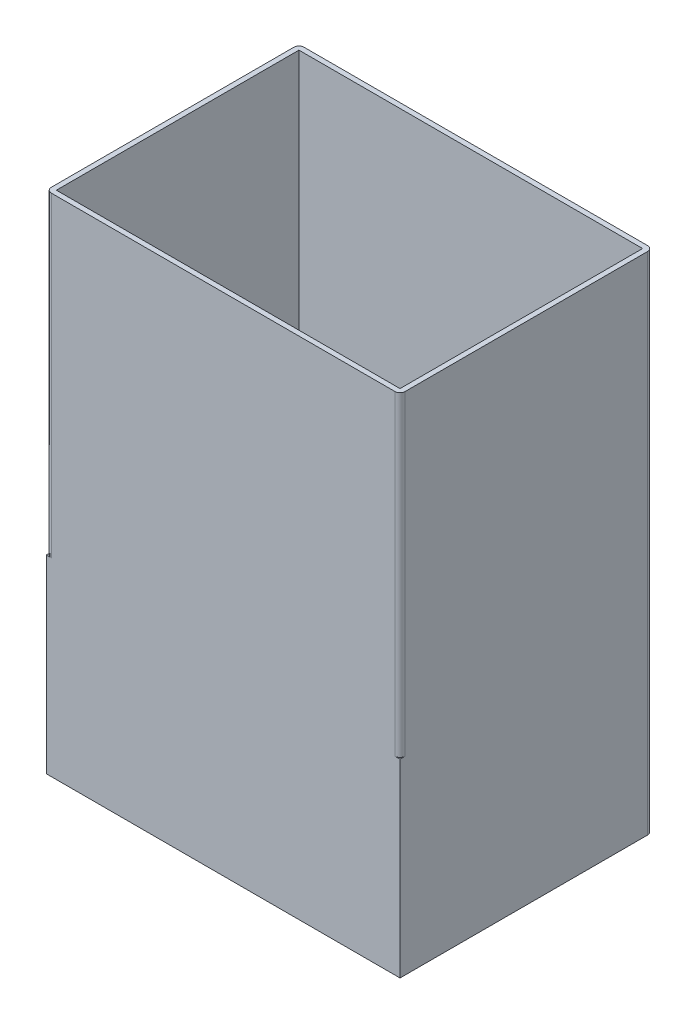
ISO-10303-21;
HEADER;
FILE_DESCRIPTION(('STEP AP214'),'2;1');
FILE_NAME('part.step','',(''),(''),'','','');
FILE_SCHEMA(('AUTOMOTIVE_DESIGN { 1 0 10303 214 1 1 1 1 }'));
ENDSEC;
DATA;
#1=APPLICATION_CONTEXT('core data for automotive mechanical design processes');
#2=APPLICATION_PROTOCOL_DEFINITION('international standard','automotive_design',2000,#1);
#3=PRODUCT_CONTEXT('',#1,'mechanical');
#4=PRODUCT('Part','Part','',(#3));
#5=PRODUCT_RELATED_PRODUCT_CATEGORY('part','',(#4));
#6=PRODUCT_DEFINITION_FORMATION('','',#4);
#7=PRODUCT_DEFINITION_CONTEXT('part definition',#1,'design');
#8=PRODUCT_DEFINITION('design','',#6,#7);
#9=PRODUCT_DEFINITION_SHAPE('','',#8);
#10=(LENGTH_UNIT() NAMED_UNIT(*) SI_UNIT(.MILLI.,.METRE.));
#11=(NAMED_UNIT(*) PLANE_ANGLE_UNIT() SI_UNIT($,.RADIAN.));
#12=(NAMED_UNIT(*) SI_UNIT($,.STERADIAN.) SOLID_ANGLE_UNIT());
#13=UNCERTAINTY_MEASURE_WITH_UNIT(LENGTH_MEASURE(1.E-05),#10,'distance_accuracy_value','');
#14=(GEOMETRIC_REPRESENTATION_CONTEXT(3) GLOBAL_UNCERTAINTY_ASSIGNED_CONTEXT((#13)) GLOBAL_UNIT_ASSIGNED_CONTEXT((#10,
#11,#12)) REPRESENTATION_CONTEXT('',''));
#15=CARTESIAN_POINT('',(0.,0.,0.));
#16=DIRECTION('',(0.,0.,1.));
#17=DIRECTION('',(1.,0.,0.));
#18=AXIS2_PLACEMENT_3D('',#15,#16,#17);
#19=CARTESIAN_POINT('',(0.,254.,0.));
#20=DIRECTION('',(1.,0.,0.));
#21=DIRECTION('',(0.,0.,-1.));
#22=AXIS2_PLACEMENT_3D('',#19,#20,#21);
#23=PLANE('',#22);
#24=DIRECTION('',(0.,-1.,0.));
#25=VECTOR('',#24,1.);
#26=CARTESIAN_POINT('',(0.,254.,0.));
#27=LINE('',#26,#25);
#28=CARTESIAN_POINT('',(0.,95.25,0.));
#29=VERTEX_POINT('',#28);
#30=CARTESIAN_POINT('',(0.,0.,0.));
#31=VERTEX_POINT('',#30);
#32=EDGE_CURVE('E213',#29,#31,#27,.T.);
#33=ORIENTED_EDGE('',*,*,#32,.F.);
#34=DIRECTION('',(0.,0.,-1.));
#35=VECTOR('',#34,1.);
#36=CARTESIAN_POINT('',(0.,95.25,-2.54));
#37=LINE('',#36,#35);
#38=CARTESIAN_POINT('',(0.,95.25,-2.54));
#39=VERTEX_POINT('',#38);
#40=EDGE_CURVE('E250',#29,#39,#37,.T.);
#41=ORIENTED_EDGE('',*,*,#40,.T.);
#42=DIRECTION('',(0.,-1.,0.));
#43=VECTOR('',#42,1.);
#44=CARTESIAN_POINT('',(0.,254.,-2.54));
#45=LINE('',#44,#43);
#46=CARTESIAN_POINT('',(0.,254.,-2.54));
#47=VERTEX_POINT('',#46);
#48=EDGE_CURVE('E244',#39,#47,#45,.F.);
#49=ORIENTED_EDGE('',*,*,#48,.T.);
#50=DIRECTION('',(0.,0.,1.));
#51=VECTOR('',#50,1.);
#52=CARTESIAN_POINT('',(0.,254.,0.));
#53=LINE('',#52,#51);
#54=CARTESIAN_POINT('',(0.,254.,-124.46));
#55=VERTEX_POINT('',#54);
#56=EDGE_CURVE('E195',#55,#47,#53,.T.);
#57=ORIENTED_EDGE('',*,*,#56,.F.);
#58=DIRECTION('',(0.,-1.,0.));
#59=VECTOR('',#58,1.);
#60=CARTESIAN_POINT('',(0.,254.,-124.46));
#61=LINE('',#60,#59);
#62=CARTESIAN_POINT('',(0.,0.,-124.46));
#63=VERTEX_POINT('',#62);
#64=EDGE_CURVE('E231',#55,#63,#61,.T.);
#65=ORIENTED_EDGE('',*,*,#64,.T.);
#66=DIRECTION('',(0.,0.,1.));
#67=VECTOR('',#66,1.);
#68=CARTESIAN_POINT('',(0.,0.,0.));
#69=LINE('',#68,#67);
#70=EDGE_CURVE('E189',#63,#31,#69,.T.);
#71=ORIENTED_EDGE('',*,*,#70,.T.);
#72=EDGE_LOOP('',(#33,#41,#49,#57,#65,#71));
#73=FACE_BOUND('',#72,.T.);
#74=ADVANCED_FACE('F43',(#73),#23,.F.);
#75=CARTESIAN_POINT('',(0.,254.,0.));
#76=DIRECTION('',(0.,0.,-1.));
#77=DIRECTION('',(-1.,0.,0.));
#78=AXIS2_PLACEMENT_3D('',#75,#76,#77);
#79=PLANE('',#78);
#80=DIRECTION('',(1.,0.,0.));
#81=VECTOR('',#80,1.);
#82=CARTESIAN_POINT('',(0.,254.,0.));
#83=LINE('',#82,#81);
#84=CARTESIAN_POINT('',(2.54,254.,0.));
#85=VERTEX_POINT('',#84);
#86=CARTESIAN_POINT('',(175.26,254.,0.));
#87=VERTEX_POINT('',#86);
#88=EDGE_CURVE('E193',#85,#87,#83,.T.);
#89=ORIENTED_EDGE('',*,*,#88,.F.);
#90=DIRECTION('',(0.,-1.,0.));
#91=VECTOR('',#90,1.);
#92=CARTESIAN_POINT('',(2.54,254.,0.));
#93=LINE('',#92,#91);
#94=CARTESIAN_POINT('',(2.54,95.25,0.));
#95=VERTEX_POINT('',#94);
#96=EDGE_CURVE('E245',#85,#95,#93,.T.);
#97=ORIENTED_EDGE('',*,*,#96,.T.);
#98=DIRECTION('',(-1.,0.,0.));
#99=VECTOR('',#98,1.);
#100=CARTESIAN_POINT('',(2.54,95.25,0.));
#101=LINE('',#100,#99);
#102=EDGE_CURVE('E239',#95,#29,#101,.T.);
#103=ORIENTED_EDGE('',*,*,#102,.T.);
#104=ORIENTED_EDGE('',*,*,#32,.T.);
#105=DIRECTION('',(1.,0.,0.));
#106=VECTOR('',#105,1.);
#107=CARTESIAN_POINT('',(0.,0.,0.));
#108=LINE('',#107,#106);
#109=CARTESIAN_POINT('',(177.8,0.,0.));
#110=VERTEX_POINT('',#109);
#111=EDGE_CURVE('E207',#31,#110,#108,.T.);
#112=ORIENTED_EDGE('',*,*,#111,.T.);
#113=DIRECTION('',(0.,-1.,0.));
#114=VECTOR('',#113,1.);
#115=CARTESIAN_POINT('',(177.8,254.,0.));
#116=LINE('',#115,#114);
#117=CARTESIAN_POINT('',(177.8,95.25,0.));
#118=VERTEX_POINT('',#117);
#119=EDGE_CURVE('E205',#118,#110,#116,.T.);
#120=ORIENTED_EDGE('',*,*,#119,.F.);
#121=DIRECTION('',(-1.,0.,0.));
#122=VECTOR('',#121,1.);
#123=CARTESIAN_POINT('',(175.26,95.25,0.));
#124=LINE('',#123,#122);
#125=CARTESIAN_POINT('',(175.26,95.25,0.));
#126=VERTEX_POINT('',#125);
#127=EDGE_CURVE('E238',#118,#126,#124,.T.);
#128=ORIENTED_EDGE('',*,*,#127,.T.);
#129=DIRECTION('',(0.,-1.,0.));
#130=VECTOR('',#129,1.);
#131=CARTESIAN_POINT('',(175.26,254.,0.));
#132=LINE('',#131,#130);
#133=EDGE_CURVE('E236',#126,#87,#132,.F.);
#134=ORIENTED_EDGE('',*,*,#133,.T.);
#135=EDGE_LOOP('',(#89,#97,#103,#104,#112,#120,#128,#134));
#136=FACE_BOUND('',#135,.T.);
#137=ADVANCED_FACE('F264',(#136),#79,.F.);
#138=CARTESIAN_POINT('',(177.8,254.,0.));
#139=DIRECTION('',(-1.,0.,0.));
#140=DIRECTION('',(0.,0.,1.));
#141=AXIS2_PLACEMENT_3D('',#138,#139,#140);
#142=PLANE('',#141);
#143=DIRECTION('',(0.,0.,-1.));
#144=VECTOR('',#143,1.);
#145=CARTESIAN_POINT('',(177.8,254.,0.));
#146=LINE('',#145,#144);
#147=CARTESIAN_POINT('',(177.8,254.,-2.54));
#148=VERTEX_POINT('',#147);
#149=CARTESIAN_POINT('',(177.8,254.,-124.46));
#150=VERTEX_POINT('',#149);
#151=EDGE_CURVE('E196',#148,#150,#146,.T.);
#152=ORIENTED_EDGE('',*,*,#151,.F.);
#153=DIRECTION('',(0.,-1.,0.));
#154=VECTOR('',#153,1.);
#155=CARTESIAN_POINT('',(177.8,254.,-2.54));
#156=LINE('',#155,#154);
#157=CARTESIAN_POINT('',(177.8,95.25,-2.54));
#158=VERTEX_POINT('',#157);
#159=EDGE_CURVE('E11',#148,#158,#156,.T.);
#160=ORIENTED_EDGE('',*,*,#159,.T.);
#161=DIRECTION('',(0.,0.,1.));
#162=VECTOR('',#161,1.);
#163=CARTESIAN_POINT('',(177.8,95.25,-2.54));
#164=LINE('',#163,#162);
#165=EDGE_CURVE('E55',#158,#118,#164,.T.);
#166=ORIENTED_EDGE('',*,*,#165,.T.);
#167=ORIENTED_EDGE('',*,*,#119,.T.);
#168=DIRECTION('',(0.,0.,-1.));
#169=VECTOR('',#168,1.);
#170=CARTESIAN_POINT('',(177.8,0.,0.));
#171=LINE('',#170,#169);
#172=CARTESIAN_POINT('',(177.8,0.,-124.46));
#173=VERTEX_POINT('',#172);
#174=EDGE_CURVE('E209',#110,#173,#171,.T.);
#175=ORIENTED_EDGE('',*,*,#174,.T.);
#176=DIRECTION('',(0.,-1.,0.));
#177=VECTOR('',#176,1.);
#178=CARTESIAN_POINT('',(177.8,254.,-124.46));
#179=LINE('',#178,#177);
#180=EDGE_CURVE('E228',#173,#150,#179,.F.);
#181=ORIENTED_EDGE('',*,*,#180,.T.);
#182=EDGE_LOOP('',(#152,#160,#166,#167,#175,#181));
#183=FACE_BOUND('',#182,.T.);
#184=ADVANCED_FACE('F266',(#183),#142,.F.);
#185=CARTESIAN_POINT('',(0.,254.,-127.));
#186=DIRECTION('',(0.,0.,1.));
#187=DIRECTION('',(1.,0.,0.));
#188=AXIS2_PLACEMENT_3D('',#185,#186,#187);
#189=PLANE('',#188);
#190=DIRECTION('',(-1.,0.,0.));
#191=VECTOR('',#190,1.);
#192=CARTESIAN_POINT('',(0.,254.,-127.));
#193=LINE('',#192,#191);
#194=CARTESIAN_POINT('',(175.26,254.,-127.));
#195=VERTEX_POINT('',#194);
#196=CARTESIAN_POINT('',(2.54,254.,-127.));
#197=VERTEX_POINT('',#196);
#198=EDGE_CURVE('E199',#195,#197,#193,.T.);
#199=ORIENTED_EDGE('',*,*,#198,.F.);
#200=DIRECTION('',(0.,-1.,0.));
#201=VECTOR('',#200,1.);
#202=CARTESIAN_POINT('',(175.26,254.,-127.));
#203=LINE('',#202,#201);
#204=CARTESIAN_POINT('',(175.26,0.,-127.));
#205=VERTEX_POINT('',#204);
#206=EDGE_CURVE('E217',#195,#205,#203,.T.);
#207=ORIENTED_EDGE('',*,*,#206,.T.);
#208=DIRECTION('',(-1.,0.,0.));
#209=VECTOR('',#208,1.);
#210=CARTESIAN_POINT('',(0.,0.,-127.));
#211=LINE('',#210,#209);
#212=CARTESIAN_POINT('',(2.54,0.,-127.));
#213=VERTEX_POINT('',#212);
#214=EDGE_CURVE('E198',#205,#213,#211,.T.);
#215=ORIENTED_EDGE('',*,*,#214,.T.);
#216=DIRECTION('',(0.,-1.,0.));
#217=VECTOR('',#216,1.);
#218=CARTESIAN_POINT('',(2.54,254.,-127.));
#219=LINE('',#218,#217);
#220=EDGE_CURVE('E220',#213,#197,#219,.F.);
#221=ORIENTED_EDGE('',*,*,#220,.T.);
#222=EDGE_LOOP('',(#199,#207,#215,#221));
#223=FACE_BOUND('',#222,.T.);
#224=ADVANCED_FACE('F279',(#223),#189,.F.);
#225=CARTESIAN_POINT('',(0.,254.,0.));
#226=DIRECTION('',(0.,-1.,0.));
#227=DIRECTION('',(0.,0.,-1.));
#228=AXIS2_PLACEMENT_3D('',#225,#226,#227);
#229=PLANE('',#228);
#230=DIRECTION('',(1.,0.,0.));
#231=VECTOR('',#230,1.);
#232=CARTESIAN_POINT('',(2.54000000000002,254.,-2.53999999999998));
#233=LINE('',#232,#231);
#234=CARTESIAN_POINT('',(2.54000000000002,254.,-2.53999999999998));
#235=VERTEX_POINT('',#234);
#236=CARTESIAN_POINT('',(175.26,254.,-2.53999999999998));
#237=VERTEX_POINT('',#236);
#238=EDGE_CURVE('E181',#235,#237,#233,.T.);
#239=ORIENTED_EDGE('',*,*,#238,.F.);
#240=DIRECTION('',(0.,0.,1.));
#241=VECTOR('',#240,1.);
#242=CARTESIAN_POINT('',(2.54,254.,-124.46));
#243=LINE('',#242,#241);
#244=CARTESIAN_POINT('',(2.54,254.,-124.46));
#245=VERTEX_POINT('',#244);
#246=EDGE_CURVE('E154',#245,#235,#243,.T.);
#247=ORIENTED_EDGE('',*,*,#246,.F.);
#248=DIRECTION('',(-1.,0.,0.));
#249=VECTOR('',#248,1.);
#250=CARTESIAN_POINT('',(2.54,254.,-124.46));
#251=LINE('',#250,#249);
#252=CARTESIAN_POINT('',(175.26,254.,-124.46));
#253=VERTEX_POINT('',#252);
#254=EDGE_CURVE('E175',#253,#245,#251,.T.);
#255=ORIENTED_EDGE('',*,*,#254,.F.);
#256=DIRECTION('',(0.,0.,-1.));
#257=VECTOR('',#256,1.);
#258=CARTESIAN_POINT('',(175.26,254.,-124.46));
#259=LINE('',#258,#257);
#260=EDGE_CURVE('E174',#237,#253,#259,.T.);
#261=ORIENTED_EDGE('',*,*,#260,.F.);
#262=EDGE_LOOP('',(#239,#247,#255,#261));
#263=FACE_BOUND('',#262,.T.);
#264=ORIENTED_EDGE('',*,*,#56,.T.);
#265=CARTESIAN_POINT('',(2.54,254.,-2.54));
#266=DIRECTION('',(0.,-1.,0.));
#267=DIRECTION('',(0.,0.,-1.));
#268=AXIS2_PLACEMENT_3D('',#265,#266,#267);
#269=CIRCLE('',#268,2.54);
#270=EDGE_CURVE('E249',#47,#85,#269,.F.);
#271=ORIENTED_EDGE('',*,*,#270,.T.);
#272=ORIENTED_EDGE('',*,*,#88,.T.);
#273=CARTESIAN_POINT('',(175.26,254.,-2.54));
#274=DIRECTION('',(0.,-1.,0.));
#275=DIRECTION('',(0.,0.,-1.));
#276=AXIS2_PLACEMENT_3D('',#273,#274,#275);
#277=CIRCLE('',#276,2.54);
#278=EDGE_CURVE('E70',#87,#148,#277,.F.);
#279=ORIENTED_EDGE('',*,*,#278,.T.);
#280=ORIENTED_EDGE('',*,*,#151,.T.);
#281=CARTESIAN_POINT('',(175.26,254.,-124.46));
#282=DIRECTION('',(0.,-1.,0.));
#283=DIRECTION('',(0.,0.,-1.));
#284=AXIS2_PLACEMENT_3D('',#281,#282,#283);
#285=CIRCLE('',#284,2.54);
#286=EDGE_CURVE('E233',#150,#195,#285,.F.);
#287=ORIENTED_EDGE('',*,*,#286,.T.);
#288=ORIENTED_EDGE('',*,*,#198,.T.);
#289=CARTESIAN_POINT('',(2.54,254.,-124.46));
#290=DIRECTION('',(0.,-1.,0.));
#291=DIRECTION('',(0.,0.,-1.));
#292=AXIS2_PLACEMENT_3D('',#289,#290,#291);
#293=CIRCLE('',#292,2.54);
#294=EDGE_CURVE('E230',#197,#55,#293,.F.);
#295=ORIENTED_EDGE('',*,*,#294,.T.);
#296=EDGE_LOOP('',(#264,#271,#272,#279,#280,#287,#288,#295));
#297=FACE_BOUND('',#296,.T.);
#298=ADVANCED_FACE('F267',(#263,#297),#229,.F.);
#299=CARTESIAN_POINT('',(0.,0.,0.));
#300=DIRECTION('',(0.,-1.,0.));
#301=DIRECTION('',(0.,0.,-1.));
#302=AXIS2_PLACEMENT_3D('',#299,#300,#301);
#303=PLANE('',#302);
#304=ORIENTED_EDGE('',*,*,#214,.F.);
#305=CARTESIAN_POINT('',(175.26,0.,-124.46));
#306=DIRECTION('',(0.,-1.,0.));
#307=DIRECTION('',(0.,0.,-1.));
#308=AXIS2_PLACEMENT_3D('',#305,#306,#307);
#309=CIRCLE('',#308,2.54);
#310=EDGE_CURVE('E221',#205,#173,#309,.T.);
#311=ORIENTED_EDGE('',*,*,#310,.T.);
#312=ORIENTED_EDGE('',*,*,#174,.F.);
#313=ORIENTED_EDGE('',*,*,#111,.F.);
#314=ORIENTED_EDGE('',*,*,#70,.F.);
#315=CARTESIAN_POINT('',(2.54,0.,-124.46));
#316=DIRECTION('',(0.,-1.,0.));
#317=DIRECTION('',(0.,0.,-1.));
#318=AXIS2_PLACEMENT_3D('',#315,#316,#317);
#319=CIRCLE('',#318,2.54);
#320=EDGE_CURVE('E224',#63,#213,#319,.T.);
#321=ORIENTED_EDGE('',*,*,#320,.T.);
#322=EDGE_LOOP('',(#304,#311,#312,#313,#314,#321));
#323=FACE_BOUND('',#322,.T.);
#324=ADVANCED_FACE('F282',(#323),#303,.T.);
#325=CARTESIAN_POINT('',(2.54,5.08,-124.46));
#326=DIRECTION('',(-1.,0.,0.));
#327=DIRECTION('',(0.,0.,1.));
#328=AXIS2_PLACEMENT_3D('',#325,#326,#327);
#329=PLANE('',#328);
#330=ORIENTED_EDGE('',*,*,#246,.T.);
#331=DIRECTION('',(0.,1.,0.));
#332=VECTOR('',#331,1.);
#333=CARTESIAN_POINT('',(2.54000000000002,5.08,-2.53999999999998));
#334=LINE('',#333,#332);
#335=CARTESIAN_POINT('',(2.54000000000002,5.08,-2.53999999999998));
#336=VERTEX_POINT('',#335);
#337=EDGE_CURVE('E149',#336,#235,#334,.T.);
#338=ORIENTED_EDGE('',*,*,#337,.F.);
#339=DIRECTION('',(0.,0.,1.));
#340=VECTOR('',#339,1.);
#341=CARTESIAN_POINT('',(2.54,5.08,-124.46));
#342=LINE('',#341,#340);
#343=CARTESIAN_POINT('',(2.54,5.08,-124.46));
#344=VERTEX_POINT('',#343);
#345=EDGE_CURVE('E155',#344,#336,#342,.T.);
#346=ORIENTED_EDGE('',*,*,#345,.F.);
#347=DIRECTION('',(0.,1.,0.));
#348=VECTOR('',#347,1.);
#349=CARTESIAN_POINT('',(2.54,5.08,-124.46));
#350=LINE('',#349,#348);
#351=EDGE_CURVE('E187',#344,#245,#350,.T.);
#352=ORIENTED_EDGE('',*,*,#351,.T.);
#353=EDGE_LOOP('',(#330,#338,#346,#352));
#354=FACE_BOUND('',#353,.T.);
#355=ADVANCED_FACE('F148',(#354),#329,.F.);
#356=CARTESIAN_POINT('',(2.54,5.08,-124.46));
#357=DIRECTION('',(0.,0.,-1.));
#358=DIRECTION('',(-1.,0.,0.));
#359=AXIS2_PLACEMENT_3D('',#356,#357,#358);
#360=PLANE('',#359);
#361=ORIENTED_EDGE('',*,*,#254,.T.);
#362=ORIENTED_EDGE('',*,*,#351,.F.);
#363=DIRECTION('',(-1.,0.,0.));
#364=VECTOR('',#363,1.);
#365=CARTESIAN_POINT('',(2.54,5.08,-124.46));
#366=LINE('',#365,#364);
#367=CARTESIAN_POINT('',(175.26,5.08,-124.46));
#368=VERTEX_POINT('',#367);
#369=EDGE_CURVE('E158',#368,#344,#366,.T.);
#370=ORIENTED_EDGE('',*,*,#369,.F.);
#371=DIRECTION('',(0.,1.,0.));
#372=VECTOR('',#371,1.);
#373=CARTESIAN_POINT('',(175.26,5.08,-124.46));
#374=LINE('',#373,#372);
#375=EDGE_CURVE('E186',#368,#253,#374,.T.);
#376=ORIENTED_EDGE('',*,*,#375,.T.);
#377=EDGE_LOOP('',(#361,#362,#370,#376));
#378=FACE_BOUND('',#377,.T.);
#379=ADVANCED_FACE('F318',(#378),#360,.F.);
#380=CARTESIAN_POINT('',(175.26,5.08,-124.46));
#381=DIRECTION('',(1.,0.,0.));
#382=DIRECTION('',(0.,0.,-1.));
#383=AXIS2_PLACEMENT_3D('',#380,#381,#382);
#384=PLANE('',#383);
#385=ORIENTED_EDGE('',*,*,#260,.T.);
#386=ORIENTED_EDGE('',*,*,#375,.F.);
#387=DIRECTION('',(0.,0.,-1.));
#388=VECTOR('',#387,1.);
#389=CARTESIAN_POINT('',(175.26,5.08,-124.46));
#390=LINE('',#389,#388);
#391=CARTESIAN_POINT('',(175.26,5.08,-2.53999999999998));
#392=VERTEX_POINT('',#391);
#393=EDGE_CURVE('E166',#392,#368,#390,.T.);
#394=ORIENTED_EDGE('',*,*,#393,.F.);
#395=DIRECTION('',(0.,1.,0.));
#396=VECTOR('',#395,1.);
#397=CARTESIAN_POINT('',(175.26,5.08,-2.53999999999998));
#398=LINE('',#397,#396);
#399=EDGE_CURVE('E156',#392,#237,#398,.T.);
#400=ORIENTED_EDGE('',*,*,#399,.T.);
#401=EDGE_LOOP('',(#385,#386,#394,#400));
#402=FACE_BOUND('',#401,.T.);
#403=ADVANCED_FACE('F324',(#402),#384,.F.);
#404=CARTESIAN_POINT('',(2.54000000000002,5.08,-2.53999999999998));
#405=DIRECTION('',(0.,0.,1.));
#406=DIRECTION('',(1.,0.,0.));
#407=AXIS2_PLACEMENT_3D('',#404,#405,#406);
#408=PLANE('',#407);
#409=ORIENTED_EDGE('',*,*,#238,.T.);
#410=ORIENTED_EDGE('',*,*,#399,.F.);
#411=DIRECTION('',(1.,0.,0.));
#412=VECTOR('',#411,1.);
#413=CARTESIAN_POINT('',(2.54000000000002,5.08,-2.53999999999998));
#414=LINE('',#413,#412);
#415=EDGE_CURVE('E161',#336,#392,#414,.T.);
#416=ORIENTED_EDGE('',*,*,#415,.F.);
#417=ORIENTED_EDGE('',*,*,#337,.T.);
#418=EDGE_LOOP('',(#409,#410,#416,#417));
#419=FACE_BOUND('',#418,.T.);
#420=ADVANCED_FACE('F165',(#419),#408,.F.);
#421=CARTESIAN_POINT('',(0.,5.08,0.));
#422=DIRECTION('',(0.,1.,0.));
#423=DIRECTION('',(0.,0.,1.));
#424=AXIS2_PLACEMENT_3D('',#421,#422,#423);
#425=PLANE('',#424);
#426=ORIENTED_EDGE('',*,*,#345,.T.);
#427=ORIENTED_EDGE('',*,*,#415,.T.);
#428=ORIENTED_EDGE('',*,*,#393,.T.);
#429=ORIENTED_EDGE('',*,*,#369,.T.);
#430=EDGE_LOOP('',(#426,#427,#428,#429));
#431=FACE_BOUND('',#430,.T.);
#432=ADVANCED_FACE('F167',(#431),#425,.T.);
#433=CARTESIAN_POINT('',(175.26,254.,-124.46));
#434=DIRECTION('',(0.,-1.,0.));
#435=DIRECTION('',(0.,0.,-1.));
#436=AXIS2_PLACEMENT_3D('',#433,#434,#435);
#437=CYLINDRICAL_SURFACE('',#436,2.54);
#438=ORIENTED_EDGE('',*,*,#286,.F.);
#439=ORIENTED_EDGE('',*,*,#180,.F.);
#440=ORIENTED_EDGE('',*,*,#310,.F.);
#441=ORIENTED_EDGE('',*,*,#206,.F.);
#442=EDGE_LOOP('',(#438,#439,#440,#441));
#443=FACE_BOUND('',#442,.T.);
#444=ADVANCED_FACE('F283',(#443),#437,.T.);
#445=CARTESIAN_POINT('',(2.54,254.,-124.46));
#446=DIRECTION('',(0.,-1.,0.));
#447=DIRECTION('',(0.,0.,-1.));
#448=AXIS2_PLACEMENT_3D('',#445,#446,#447);
#449=CYLINDRICAL_SURFACE('',#448,2.54);
#450=ORIENTED_EDGE('',*,*,#294,.F.);
#451=ORIENTED_EDGE('',*,*,#220,.F.);
#452=ORIENTED_EDGE('',*,*,#320,.F.);
#453=ORIENTED_EDGE('',*,*,#64,.F.);
#454=EDGE_LOOP('',(#450,#451,#452,#453));
#455=FACE_BOUND('',#454,.T.);
#456=ADVANCED_FACE('F292',(#455),#449,.T.);
#457=CARTESIAN_POINT('',(2.54,95.25,-2.54));
#458=DIRECTION('',(0.,1.,0.));
#459=DIRECTION('',(0.,0.,1.));
#460=AXIS2_PLACEMENT_3D('',#457,#458,#459);
#461=PLANE('',#460);
#462=ORIENTED_EDGE('',*,*,#40,.F.);
#463=ORIENTED_EDGE('',*,*,#102,.F.);
#464=CARTESIAN_POINT('',(2.54,95.25,-2.54));
#465=DIRECTION('',(0.,-1.,0.));
#466=DIRECTION('',(0.,0.,-1.));
#467=AXIS2_PLACEMENT_3D('',#464,#465,#466);
#468=CIRCLE('',#467,2.54);
#469=EDGE_CURVE('E185',#39,#95,#468,.F.);
#470=ORIENTED_EDGE('',*,*,#469,.F.);
#471=EDGE_LOOP('',(#462,#463,#470));
#472=FACE_BOUND('',#471,.T.);
#473=ADVANCED_FACE('F263',(#472),#461,.T.);
#474=CARTESIAN_POINT('',(2.54,254.,-2.54));
#475=DIRECTION('',(0.,-1.,0.));
#476=DIRECTION('',(0.,0.,-1.));
#477=AXIS2_PLACEMENT_3D('',#474,#475,#476);
#478=CYLINDRICAL_SURFACE('',#477,2.54);
#479=ORIENTED_EDGE('',*,*,#270,.F.);
#480=ORIENTED_EDGE('',*,*,#48,.F.);
#481=ORIENTED_EDGE('',*,*,#469,.T.);
#482=ORIENTED_EDGE('',*,*,#96,.F.);
#483=EDGE_LOOP('',(#479,#480,#481,#482));
#484=FACE_BOUND('',#483,.T.);
#485=ADVANCED_FACE('F259',(#484),#478,.T.);
#486=CARTESIAN_POINT('',(175.26,95.25,-2.54));
#487=DIRECTION('',(0.,1.,0.));
#488=DIRECTION('',(0.,0.,1.));
#489=AXIS2_PLACEMENT_3D('',#486,#487,#488);
#490=PLANE('',#489);
#491=ORIENTED_EDGE('',*,*,#127,.F.);
#492=ORIENTED_EDGE('',*,*,#165,.F.);
#493=CARTESIAN_POINT('',(175.26,95.25,-2.54));
#494=DIRECTION('',(0.,-1.,0.));
#495=DIRECTION('',(0.,0.,-1.));
#496=AXIS2_PLACEMENT_3D('',#493,#494,#495);
#497=CIRCLE('',#496,2.54);
#498=EDGE_CURVE('E50',#126,#158,#497,.F.);
#499=ORIENTED_EDGE('',*,*,#498,.F.);
#500=EDGE_LOOP('',(#491,#492,#499));
#501=FACE_BOUND('',#500,.T.);
#502=ADVANCED_FACE('F44',(#501),#490,.T.);
#503=CARTESIAN_POINT('',(175.26,254.,-2.54));
#504=DIRECTION('',(0.,-1.,0.));
#505=DIRECTION('',(0.,0.,-1.));
#506=AXIS2_PLACEMENT_3D('',#503,#504,#505);
#507=CYLINDRICAL_SURFACE('',#506,2.54);
#508=ORIENTED_EDGE('',*,*,#278,.F.);
#509=ORIENTED_EDGE('',*,*,#133,.F.);
#510=ORIENTED_EDGE('',*,*,#498,.T.);
#511=ORIENTED_EDGE('',*,*,#159,.F.);
#512=EDGE_LOOP('',(#508,#509,#510,#511));
#513=FACE_BOUND('',#512,.T.);
#514=ADVANCED_FACE('F269',(#513),#507,.T.);
#515=CLOSED_SHELL('',(#74,#137,#184,#224,#298,#324,#355,#379,#403,#420,#432,#444,#456,#473,#485,
#502,#514));
#516=MANIFOLD_SOLID_BREP('B2',#515);
#517=ADVANCED_BREP_SHAPE_REPRESENTATION('',(#18,#516),#14);
#518=SHAPE_DEFINITION_REPRESENTATION(#9,#517);
ENDSEC;
END-ISO-10303-21;
